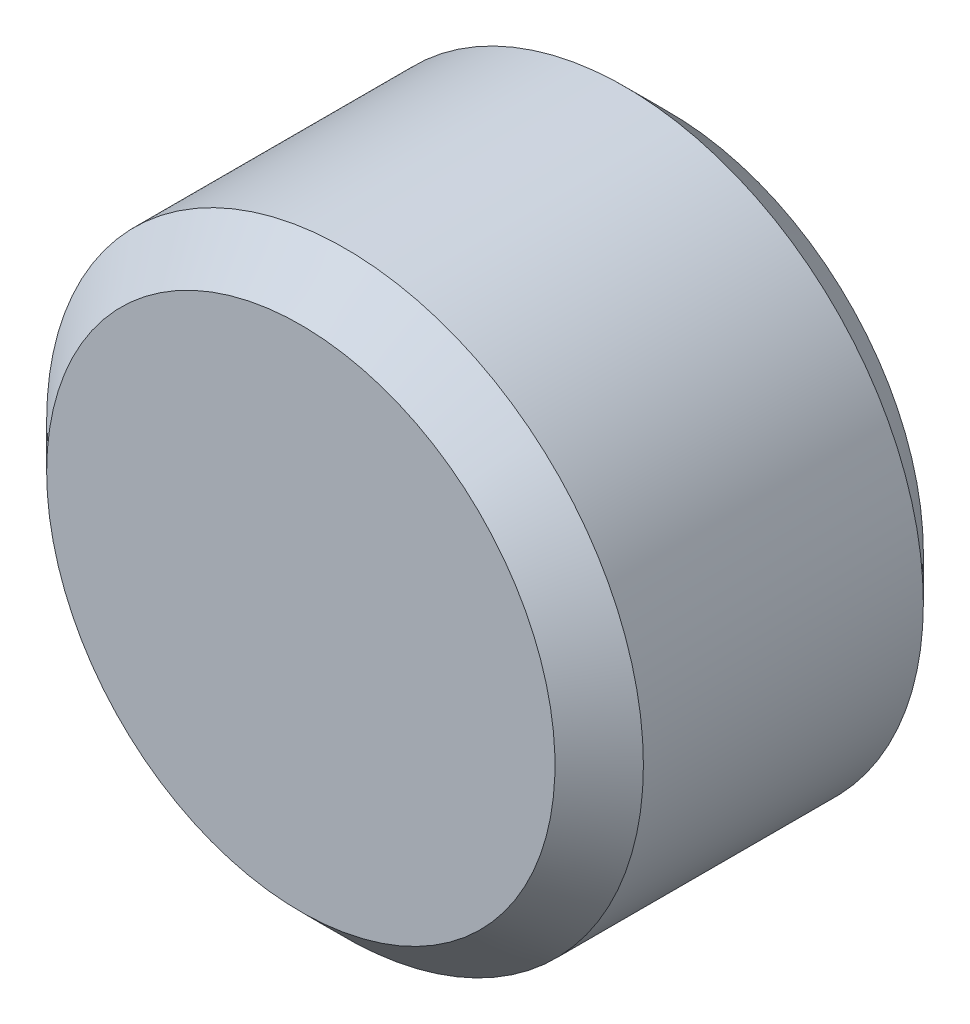
ISO-10303-21;
HEADER;
FILE_DESCRIPTION(('STEP AP214'),'2;1');
FILE_NAME('part.step','',(''),(''),'','','');
FILE_SCHEMA(('AUTOMOTIVE_DESIGN { 1 0 10303 214 1 1 1 1 }'));
ENDSEC;
DATA;
#1=APPLICATION_CONTEXT('core data for automotive mechanical design processes');
#2=APPLICATION_PROTOCOL_DEFINITION('international standard','automotive_design',2000,#1);
#3=PRODUCT_CONTEXT('',#1,'mechanical');
#4=PRODUCT('Part','Part','',(#3));
#5=PRODUCT_RELATED_PRODUCT_CATEGORY('part','',(#4));
#6=PRODUCT_DEFINITION_FORMATION('','',#4);
#7=PRODUCT_DEFINITION_CONTEXT('part definition',#1,'design');
#8=PRODUCT_DEFINITION('design','',#6,#7);
#9=PRODUCT_DEFINITION_SHAPE('','',#8);
#10=(LENGTH_UNIT() NAMED_UNIT(*) SI_UNIT(.MILLI.,.METRE.));
#11=(NAMED_UNIT(*) PLANE_ANGLE_UNIT() SI_UNIT($,.RADIAN.));
#12=(NAMED_UNIT(*) SI_UNIT($,.STERADIAN.) SOLID_ANGLE_UNIT());
#13=UNCERTAINTY_MEASURE_WITH_UNIT(LENGTH_MEASURE(1.E-05),#10,'distance_accuracy_value','');
#14=(GEOMETRIC_REPRESENTATION_CONTEXT(3) GLOBAL_UNCERTAINTY_ASSIGNED_CONTEXT((#13)) GLOBAL_UNIT_ASSIGNED_CONTEXT((#10,
#11,#12)) REPRESENTATION_CONTEXT('',''));
#15=CARTESIAN_POINT('',(0.,0.,0.));
#16=DIRECTION('',(0.,0.,1.));
#17=DIRECTION('',(1.,0.,0.));
#18=AXIS2_PLACEMENT_3D('',#15,#16,#17);
#19=CARTESIAN_POINT('',(-0.862364792336765,-0.8274298420525,0.));
#20=DIRECTION('',(0.,-1.,0.));
#21=DIRECTION('',(0.,0.,-1.));
#22=AXIS2_PLACEMENT_3D('',#19,#20,#21);
#23=PLANE('',#22);
#24=DIRECTION('',(0.,0.,1.));
#25=VECTOR('',#24,1.);
#26=CARTESIAN_POINT('',(-0.86236479233677,-0.827429842052503,0.));
#27=LINE('',#26,#25);
#28=CARTESIAN_POINT('',(-0.862364792336766,-0.827429842052501,-3.175));
#29=VERTEX_POINT('',#28);
#30=CARTESIAN_POINT('',(-0.862364792336766,-0.827429842052501,0.));
#31=VERTEX_POINT('',#30);
#32=EDGE_CURVE('E83',#29,#31,#27,.T.);
#33=ORIENTED_EDGE('',*,*,#32,.T.);
#34=DIRECTION('',(1.,0.,0.));
#35=VECTOR('',#34,1.);
#36=CARTESIAN_POINT('',(-0.862364792336765,-0.8274298420525,0.));
#37=LINE('',#36,#35);
#38=CARTESIAN_POINT('',(0.725135207663235,-0.8274298420525,0.));
#39=VERTEX_POINT('',#38);
#40=EDGE_CURVE('E72',#39,#31,#37,.F.);
#41=ORIENTED_EDGE('',*,*,#40,.F.);
#42=DIRECTION('',(0.,0.,1.));
#43=VECTOR('',#42,1.);
#44=CARTESIAN_POINT('',(0.725135207663235,-0.8274298420525,0.));
#45=LINE('',#44,#43);
#46=CARTESIAN_POINT('',(0.725135207663235,-0.8274298420525,-3.175));
#47=VERTEX_POINT('',#46);
#48=EDGE_CURVE('E91',#39,#47,#45,.F.);
#49=ORIENTED_EDGE('',*,*,#48,.T.);
#50=DIRECTION('',(1.,0.,0.));
#51=VECTOR('',#50,1.);
#52=CARTESIAN_POINT('',(-0.862364792336765,-0.8274298420525,-3.175));
#53=LINE('',#52,#51);
#54=EDGE_CURVE('E67',#29,#47,#53,.T.);
#55=ORIENTED_EDGE('',*,*,#54,.F.);
#56=EDGE_LOOP('',(#33,#41,#49,#55));
#57=FACE_BOUND('',#56,.T.);
#58=ADVANCED_FACE('F17',(#57),#23,.F.);
#59=CARTESIAN_POINT('',(-1.65611479233677,0.547385486455286,0.));
#60=DIRECTION('',(-0.866025403784439,-0.5,0.));
#61=DIRECTION('',(0.5,-0.866025403784439,0.));
#62=AXIS2_PLACEMENT_3D('',#59,#60,#61);
#63=PLANE('',#62);
#64=DIRECTION('',(0.,0.,1.));
#65=VECTOR('',#64,1.);
#66=CARTESIAN_POINT('',(-1.65611479233677,0.547385486455289,0.));
#67=LINE('',#66,#65);
#68=CARTESIAN_POINT('',(-1.65611479233677,0.547385486455286,-3.175));
#69=VERTEX_POINT('',#68);
#70=CARTESIAN_POINT('',(-1.65611479233677,0.547385486455287,0.));
#71=VERTEX_POINT('',#70);
#72=EDGE_CURVE('E87',#69,#71,#67,.T.);
#73=ORIENTED_EDGE('',*,*,#72,.T.);
#74=DIRECTION('',(0.5,-0.866025403784439,0.));
#75=VECTOR('',#74,1.);
#76=CARTESIAN_POINT('',(-1.65611479233677,0.547385486455286,0.));
#77=LINE('',#76,#75);
#78=EDGE_CURVE('E77',#31,#71,#77,.F.);
#79=ORIENTED_EDGE('',*,*,#78,.F.);
#80=ORIENTED_EDGE('',*,*,#32,.F.);
#81=DIRECTION('',(0.5,-0.866025403784439,0.));
#82=VECTOR('',#81,1.);
#83=CARTESIAN_POINT('',(-1.65611479233677,0.547385486455286,-3.175));
#84=LINE('',#83,#82);
#85=EDGE_CURVE('E89',#69,#29,#84,.T.);
#86=ORIENTED_EDGE('',*,*,#85,.F.);
#87=EDGE_LOOP('',(#73,#79,#80,#86));
#88=FACE_BOUND('',#87,.T.);
#89=ADVANCED_FACE('F86',(#88),#63,.F.);
#90=CARTESIAN_POINT('',(0.725135207663235,-0.8274298420525,0.));
#91=DIRECTION('',(0.866025403784439,-0.5,0.));
#92=DIRECTION('',(0.5,0.866025403784439,0.));
#93=AXIS2_PLACEMENT_3D('',#90,#91,#92);
#94=PLANE('',#93);
#95=ORIENTED_EDGE('',*,*,#48,.F.);
#96=DIRECTION('',(0.500000000000003,0.866025403784437,0.));
#97=VECTOR('',#96,1.);
#98=CARTESIAN_POINT('',(0.725135207663235,-0.8274298420525,0.));
#99=LINE('',#98,#97);
#100=CARTESIAN_POINT('',(1.51888520766323,0.547385486455286,0.));
#101=VERTEX_POINT('',#100);
#102=EDGE_CURVE('E79',#39,#101,#99,.T.);
#103=ORIENTED_EDGE('',*,*,#102,.T.);
#104=DIRECTION('',(0.,0.,1.));
#105=VECTOR('',#104,1.);
#106=CARTESIAN_POINT('',(1.51888520766323,0.547385486455286,0.));
#107=LINE('',#106,#105);
#108=CARTESIAN_POINT('',(1.51888520766323,0.547385486455288,-3.175));
#109=VERTEX_POINT('',#108);
#110=EDGE_CURVE('E120',#101,#109,#107,.F.);
#111=ORIENTED_EDGE('',*,*,#110,.T.);
#112=DIRECTION('',(0.5,0.866025403784439,0.));
#113=VECTOR('',#112,1.);
#114=CARTESIAN_POINT('',(0.725135207663235,-0.8274298420525,-3.175));
#115=LINE('',#114,#113);
#116=EDGE_CURVE('E130',#47,#109,#115,.T.);
#117=ORIENTED_EDGE('',*,*,#116,.F.);
#118=EDGE_LOOP('',(#95,#103,#111,#117));
#119=FACE_BOUND('',#118,.T.);
#120=ADVANCED_FACE('F133',(#119),#94,.F.);
#121=CARTESIAN_POINT('',(-0.862364792336765,1.9222008149631,0.));
#122=DIRECTION('',(-0.866025403784439,0.5,0.));
#123=DIRECTION('',(-0.5,-0.866025403784439,0.));
#124=AXIS2_PLACEMENT_3D('',#121,#122,#123);
#125=PLANE('',#124);
#126=DIRECTION('',(0.,0.,1.));
#127=VECTOR('',#126,1.);
#128=CARTESIAN_POINT('',(-0.862364792336765,1.9222008149631,0.));
#129=LINE('',#128,#127);
#130=CARTESIAN_POINT('',(-0.862364792336765,1.9222008149631,-3.175));
#131=VERTEX_POINT('',#130);
#132=CARTESIAN_POINT('',(-0.862364792336765,1.9222008149631,0.));
#133=VERTEX_POINT('',#132);
#134=EDGE_CURVE('E116',#131,#133,#129,.T.);
#135=ORIENTED_EDGE('',*,*,#134,.T.);
#136=DIRECTION('',(-0.499999999999996,-0.866025403784441,0.));
#137=VECTOR('',#136,1.);
#138=CARTESIAN_POINT('',(-0.862364792336765,1.9222008149631,0.));
#139=LINE('',#138,#137);
#140=EDGE_CURVE('E126',#133,#71,#139,.T.);
#141=ORIENTED_EDGE('',*,*,#140,.T.);
#142=ORIENTED_EDGE('',*,*,#72,.F.);
#143=DIRECTION('',(-0.5,-0.866025403784439,0.));
#144=VECTOR('',#143,1.);
#145=CARTESIAN_POINT('',(-0.862364792336765,1.9222008149631,-3.175));
#146=LINE('',#145,#144);
#147=EDGE_CURVE('E35',#131,#69,#146,.T.);
#148=ORIENTED_EDGE('',*,*,#147,.F.);
#149=EDGE_LOOP('',(#135,#141,#142,#148));
#150=FACE_BOUND('',#149,.T.);
#151=ADVANCED_FACE('F139',(#150),#125,.F.);
#152=CARTESIAN_POINT('',(0.398976116754146,0.547385486455286,0.));
#153=DIRECTION('',(0.,0.,1.));
#154=DIRECTION('',(1.,0.,0.));
#155=AXIS2_PLACEMENT_3D('',#152,#153,#154);
#156=PLANE('',#155);
#157=DIRECTION('',(-0.5,0.866025403784439,0.));
#158=VECTOR('',#157,1.);
#159=CARTESIAN_POINT('',(1.51888520766323,0.547385486455286,0.));
#160=LINE('',#159,#158);
#161=CARTESIAN_POINT('',(0.725135207663233,1.9222008149631,0.));
#162=VERTEX_POINT('',#161);
#163=EDGE_CURVE('E123',#162,#101,#160,.F.);
#164=ORIENTED_EDGE('',*,*,#163,.T.);
#165=ORIENTED_EDGE('',*,*,#102,.F.);
#166=ORIENTED_EDGE('',*,*,#40,.T.);
#167=ORIENTED_EDGE('',*,*,#78,.T.);
#168=ORIENTED_EDGE('',*,*,#140,.F.);
#169=DIRECTION('',(1.,0.,0.));
#170=VECTOR('',#169,1.);
#171=CARTESIAN_POINT('',(0.725135207663235,1.9222008149631,0.));
#172=LINE('',#171,#170);
#173=EDGE_CURVE('E112',#133,#162,#172,.T.);
#174=ORIENTED_EDGE('',*,*,#173,.T.);
#175=EDGE_LOOP('',(#164,#165,#166,#167,#168,#174));
#176=FACE_BOUND('',#175,.T.);
#177=ADVANCED_FACE('F74',(#176),#156,.F.);
#178=CARTESIAN_POINT('',(1.51888520766323,0.547385486455286,0.));
#179=DIRECTION('',(0.866025403784439,0.5,0.));
#180=DIRECTION('',(-0.5,0.866025403784439,0.));
#181=AXIS2_PLACEMENT_3D('',#178,#179,#180);
#182=PLANE('',#181);
#183=ORIENTED_EDGE('',*,*,#110,.F.);
#184=ORIENTED_EDGE('',*,*,#163,.F.);
#185=DIRECTION('',(0.,0.,1.));
#186=VECTOR('',#185,1.);
#187=CARTESIAN_POINT('',(0.725135207663235,1.9222008149631,0.));
#188=LINE('',#187,#186);
#189=CARTESIAN_POINT('',(0.725135207663232,1.9222008149631,-3.175));
#190=VERTEX_POINT('',#189);
#191=EDGE_CURVE('E106',#162,#190,#188,.F.);
#192=ORIENTED_EDGE('',*,*,#191,.T.);
#193=DIRECTION('',(-0.5,0.866025403784439,0.));
#194=VECTOR('',#193,1.);
#195=CARTESIAN_POINT('',(1.51888520766323,0.547385486455286,-3.175));
#196=LINE('',#195,#194);
#197=EDGE_CURVE('E117',#109,#190,#196,.T.);
#198=ORIENTED_EDGE('',*,*,#197,.F.);
#199=EDGE_LOOP('',(#183,#184,#192,#198));
#200=FACE_BOUND('',#199,.T.);
#201=ADVANCED_FACE('F144',(#200),#182,.F.);
#202=CARTESIAN_POINT('',(0.725135207663235,1.9222008149631,0.));
#203=DIRECTION('',(0.,1.,0.));
#204=DIRECTION('',(0.,0.,1.));
#205=AXIS2_PLACEMENT_3D('',#202,#203,#204);
#206=PLANE('',#205);
#207=ORIENTED_EDGE('',*,*,#191,.F.);
#208=ORIENTED_EDGE('',*,*,#173,.F.);
#209=ORIENTED_EDGE('',*,*,#134,.F.);
#210=DIRECTION('',(1.,0.,0.));
#211=VECTOR('',#210,1.);
#212=CARTESIAN_POINT('',(0.398976116754146,1.9222008149631,-3.175));
#213=LINE('',#212,#211);
#214=EDGE_CURVE('E102',#131,#190,#213,.T.);
#215=ORIENTED_EDGE('',*,*,#214,.T.);
#216=EDGE_LOOP('',(#207,#208,#209,#215));
#217=FACE_BOUND('',#216,.T.);
#218=ADVANCED_FACE('F142',(#217),#206,.F.);
#219=CARTESIAN_POINT('',(0.398976116754146,0.547385486455286,3.175));
#220=DIRECTION('',(0.,0.,1.));
#221=DIRECTION('',(1.,0.,0.));
#222=AXIS2_PLACEMENT_3D('',#219,#220,#221);
#223=PLANE('',#222);
#224=CARTESIAN_POINT('',(-0.068614792336765,0.547385486455286,3.17500000033988));
#225=DIRECTION('',(0.,0.,-1.));
#226=DIRECTION('',(-1.,0.,0.));
#227=AXIS2_PLACEMENT_3D('',#224,#225,#226);
#228=CIRCLE('',#227,4.38150000029581);
#229=CARTESIAN_POINT('',(-4.45011479263258,0.547385486455286,3.17500000033988));
#230=VERTEX_POINT('',#229);
#231=EDGE_CURVE('E20',#230,#230,#228,.T.);
#232=ORIENTED_EDGE('',*,*,#231,.F.);
#233=EDGE_LOOP('',(#232));
#234=FACE_BOUND('',#233,.T.);
#235=ADVANCED_FACE('F152',(#234),#223,.T.);
#236=CARTESIAN_POINT('',(0.398976116754146,0.547385486455286,-3.175));
#237=DIRECTION('',(0.,0.,1.));
#238=DIRECTION('',(1.,0.,0.));
#239=AXIS2_PLACEMENT_3D('',#236,#237,#238);
#240=PLANE('',#239);
#241=ORIENTED_EDGE('',*,*,#147,.T.);
#242=ORIENTED_EDGE('',*,*,#85,.T.);
#243=ORIENTED_EDGE('',*,*,#54,.T.);
#244=ORIENTED_EDGE('',*,*,#116,.T.);
#245=ORIENTED_EDGE('',*,*,#197,.T.);
#246=ORIENTED_EDGE('',*,*,#214,.F.);
#247=EDGE_LOOP('',(#241,#242,#243,#244,#245,#246));
#248=FACE_BOUND('',#247,.T.);
#249=CARTESIAN_POINT('',(-0.068614792336765,0.547385486455286,-3.17500000033988));
#250=DIRECTION('',(0.,0.,1.));
#251=DIRECTION('',(1.,0.,0.));
#252=AXIS2_PLACEMENT_3D('',#249,#250,#251);
#253=CIRCLE('',#252,4.38150000029581);
#254=CARTESIAN_POINT('',(4.31288520795905,0.547385486455286,-3.17500000033988));
#255=VERTEX_POINT('',#254);
#256=EDGE_CURVE('E95',#255,#255,#253,.T.);
#257=ORIENTED_EDGE('',*,*,#256,.F.);
#258=EDGE_LOOP('',(#257));
#259=FACE_BOUND('',#258,.T.);
#260=ADVANCED_FACE('F137',(#248,#259),#240,.F.);
#261=CARTESIAN_POINT('',(-0.068614792336765,0.547385486455286,2.41299999964895));
#262=DIRECTION('',(0.,0.,-1.));
#263=DIRECTION('',(-1.,0.,0.));
#264=AXIS2_PLACEMENT_3D('',#261,#262,#263);
#265=CONICAL_SURFACE('',#264,5.14349999967934,0.785398162539575);
#266=ORIENTED_EDGE('',*,*,#231,.T.);
#267=EDGE_LOOP('',(#266));
#268=FACE_BOUND('',#267,.T.);
#269=CARTESIAN_POINT('',(-0.0686147923367652,0.547385486455286,2.413));
#270=DIRECTION('',(0.,0.,-1.));
#271=DIRECTION('',(-1.,0.,0.));
#272=AXIS2_PLACEMENT_3D('',#269,#270,#271);
#273=CIRCLE('',#272,5.1435);
#274=CARTESIAN_POINT('',(-5.21211479233677,0.547385486455286,2.413));
#275=VERTEX_POINT('',#274);
#276=EDGE_CURVE('E26',#275,#275,#273,.T.);
#277=ORIENTED_EDGE('',*,*,#276,.F.);
#278=EDGE_LOOP('',(#277));
#279=FACE_BOUND('',#278,.T.);
#280=ADVANCED_FACE('F163',(#268,#279),#265,.T.);
#281=CARTESIAN_POINT('',(-0.068614792336765,0.547385486455286,-2.41299999964895));
#282=DIRECTION('',(0.,0.,1.));
#283=DIRECTION('',(1.,0.,0.));
#284=AXIS2_PLACEMENT_3D('',#281,#282,#283);
#285=CONICAL_SURFACE('',#284,5.14349999967934,0.785398162539575);
#286=ORIENTED_EDGE('',*,*,#256,.T.);
#287=EDGE_LOOP('',(#286));
#288=FACE_BOUND('',#287,.T.);
#289=CARTESIAN_POINT('',(-0.0686147923367652,0.547385486455286,-2.413));
#290=DIRECTION('',(0.,0.,-1.));
#291=DIRECTION('',(-1.,0.,0.));
#292=AXIS2_PLACEMENT_3D('',#289,#290,#291);
#293=CIRCLE('',#292,5.1435);
#294=CARTESIAN_POINT('',(-5.21211479233677,0.547385486455286,-2.413));
#295=VERTEX_POINT('',#294);
#296=EDGE_CURVE('E11',#295,#295,#293,.F.);
#297=ORIENTED_EDGE('',*,*,#296,.F.);
#298=EDGE_LOOP('',(#297));
#299=FACE_BOUND('',#298,.T.);
#300=ADVANCED_FACE('F157',(#288,#299),#285,.T.);
#301=CARTESIAN_POINT('',(-0.0686147923367652,0.547385486455286,0.));
#302=DIRECTION('',(0.,0.,-1.));
#303=DIRECTION('',(-1.,0.,0.));
#304=AXIS2_PLACEMENT_3D('',#301,#302,#303);
#305=CYLINDRICAL_SURFACE('',#304,5.1435);
#306=ORIENTED_EDGE('',*,*,#276,.T.);
#307=EDGE_LOOP('',(#306));
#308=FACE_BOUND('',#307,.T.);
#309=ORIENTED_EDGE('',*,*,#296,.T.);
#310=EDGE_LOOP('',(#309));
#311=FACE_BOUND('',#310,.T.);
#312=ADVANCED_FACE('F155',(#308,#311),#305,.T.);
#313=CLOSED_SHELL('',(#58,#89,#120,#151,#177,#201,#218,#235,#260,#280,#300,#312));
#314=MANIFOLD_SOLID_BREP('B1',#313);
#315=ADVANCED_BREP_SHAPE_REPRESENTATION('',(#18,#314),#14);
#316=SHAPE_DEFINITION_REPRESENTATION(#9,#315);
ENDSEC;
END-ISO-10303-21;
